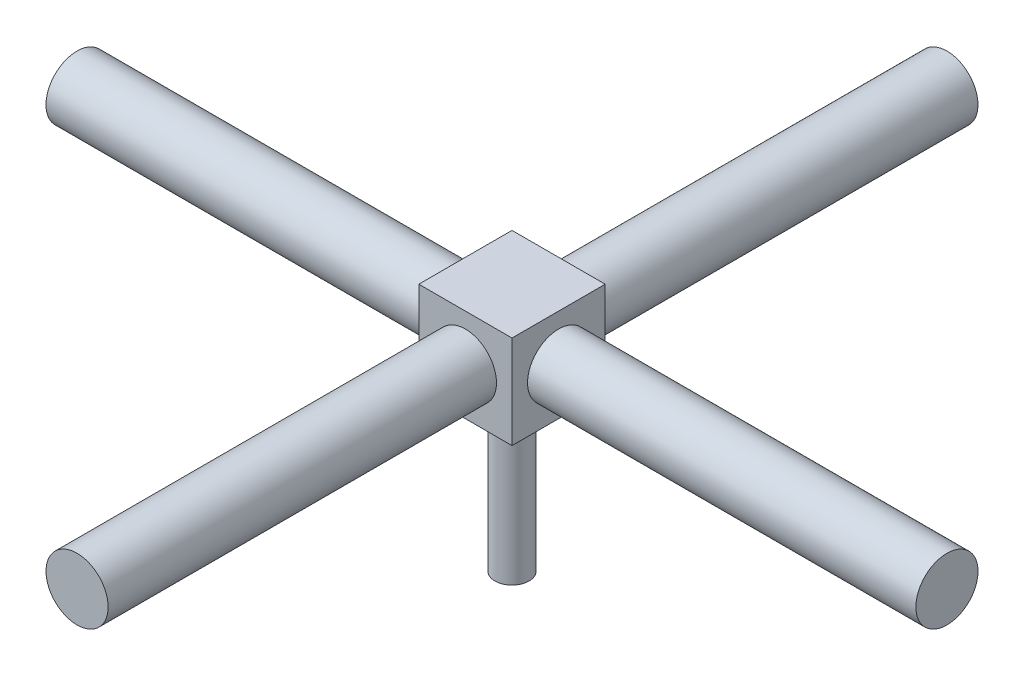
ISO-10303-21;
HEADER;
FILE_DESCRIPTION(('STEP AP214'),'2;1');
FILE_NAME('part.step','',(''),(''),'','','');
FILE_SCHEMA(('AUTOMOTIVE_DESIGN { 1 0 10303 214 1 1 1 1 }'));
ENDSEC;
DATA;
#1=APPLICATION_CONTEXT('core data for automotive mechanical design processes');
#2=APPLICATION_PROTOCOL_DEFINITION('international standard','automotive_design',2000,#1);
#3=PRODUCT_CONTEXT('',#1,'mechanical');
#4=PRODUCT('Part','Part','',(#3));
#5=PRODUCT_RELATED_PRODUCT_CATEGORY('part','',(#4));
#6=PRODUCT_DEFINITION_FORMATION('','',#4);
#7=PRODUCT_DEFINITION_CONTEXT('part definition',#1,'design');
#8=PRODUCT_DEFINITION('design','',#6,#7);
#9=PRODUCT_DEFINITION_SHAPE('','',#8);
#10=(LENGTH_UNIT() NAMED_UNIT(*) SI_UNIT(.MILLI.,.METRE.));
#11=(NAMED_UNIT(*) PLANE_ANGLE_UNIT() SI_UNIT($,.RADIAN.));
#12=(NAMED_UNIT(*) SI_UNIT($,.STERADIAN.) SOLID_ANGLE_UNIT());
#13=UNCERTAINTY_MEASURE_WITH_UNIT(LENGTH_MEASURE(1.E-05),#10,'distance_accuracy_value','');
#14=(GEOMETRIC_REPRESENTATION_CONTEXT(3) GLOBAL_UNCERTAINTY_ASSIGNED_CONTEXT((#13)) GLOBAL_UNIT_ASSIGNED_CONTEXT((#10,
#11,#12)) REPRESENTATION_CONTEXT('',''));
#15=CARTESIAN_POINT('',(0.,0.,0.));
#16=DIRECTION('',(0.,0.,1.));
#17=DIRECTION('',(1.,0.,0.));
#18=AXIS2_PLACEMENT_3D('',#15,#16,#17);
#19=CARTESIAN_POINT('',(-30.,60.,-30.));
#20=DIRECTION('',(1.,0.,0.));
#21=DIRECTION('',(0.,0.,-1.));
#22=AXIS2_PLACEMENT_3D('',#19,#20,#21);
#23=PLANE('',#22);
#24=CARTESIAN_POINT('',(-30.,30.,0.));
#25=DIRECTION('',(-1.,0.,0.));
#26=DIRECTION('',(0.,0.,1.));
#27=AXIS2_PLACEMENT_3D('',#24,#25,#26);
#28=CIRCLE('',#27,20.);
#29=CARTESIAN_POINT('',(-30.,30.,20.));
#30=VERTEX_POINT('',#29);
#31=EDGE_CURVE('E138',#30,#30,#28,.T.);
#32=ORIENTED_EDGE('',*,*,#31,.F.);
#33=EDGE_LOOP('',(#32));
#34=FACE_BOUND('',#33,.T.);
#35=DIRECTION('',(0.,0.,1.));
#36=VECTOR('',#35,1.);
#37=CARTESIAN_POINT('',(-30.,0.,-30.));
#38=LINE('',#37,#36);
#39=CARTESIAN_POINT('',(-30.,0.,-30.));
#40=VERTEX_POINT('',#39);
#41=CARTESIAN_POINT('',(-30.,0.,30.));
#42=VERTEX_POINT('',#41);
#43=EDGE_CURVE('E113',#40,#42,#38,.T.);
#44=ORIENTED_EDGE('',*,*,#43,.T.);
#45=DIRECTION('',(0.,-1.,0.));
#46=VECTOR('',#45,1.);
#47=CARTESIAN_POINT('',(-30.,60.,30.));
#48=LINE('',#47,#46);
#49=CARTESIAN_POINT('',(-30.,60.,30.));
#50=VERTEX_POINT('',#49);
#51=EDGE_CURVE('E44',#50,#42,#48,.T.);
#52=ORIENTED_EDGE('',*,*,#51,.F.);
#53=DIRECTION('',(0.,0.,1.));
#54=VECTOR('',#53,1.);
#55=CARTESIAN_POINT('',(-30.,60.,-30.));
#56=LINE('',#55,#54);
#57=CARTESIAN_POINT('',(-30.,60.,-30.));
#58=VERTEX_POINT('',#57);
#59=EDGE_CURVE('E96',#58,#50,#56,.T.);
#60=ORIENTED_EDGE('',*,*,#59,.F.);
#61=DIRECTION('',(0.,-1.,0.));
#62=VECTOR('',#61,1.);
#63=CARTESIAN_POINT('',(-30.,60.,-30.));
#64=LINE('',#63,#62);
#65=EDGE_CURVE('E109',#58,#40,#64,.T.);
#66=ORIENTED_EDGE('',*,*,#65,.T.);
#67=EDGE_LOOP('',(#44,#52,#60,#66));
#68=FACE_BOUND('',#67,.T.);
#69=ADVANCED_FACE('F41',(#34,#68),#23,.F.);
#70=CARTESIAN_POINT('',(30.,60.,30.));
#71=DIRECTION('',(0.,0.,-1.));
#72=DIRECTION('',(-1.,0.,0.));
#73=AXIS2_PLACEMENT_3D('',#70,#71,#72);
#74=PLANE('',#73);
#75=CARTESIAN_POINT('',(0.,30.,30.));
#76=DIRECTION('',(0.,0.,1.));
#77=DIRECTION('',(1.,0.,0.));
#78=AXIS2_PLACEMENT_3D('',#75,#76,#77);
#79=CIRCLE('',#78,20.);
#80=CARTESIAN_POINT('',(20.,30.,30.));
#81=VERTEX_POINT('',#80);
#82=EDGE_CURVE('E134',#81,#81,#79,.T.);
#83=ORIENTED_EDGE('',*,*,#82,.F.);
#84=EDGE_LOOP('',(#83));
#85=FACE_BOUND('',#84,.T.);
#86=DIRECTION('',(1.,0.,0.));
#87=VECTOR('',#86,1.);
#88=CARTESIAN_POINT('',(30.,0.,30.));
#89=LINE('',#88,#87);
#90=CARTESIAN_POINT('',(30.,0.,30.));
#91=VERTEX_POINT('',#90);
#92=EDGE_CURVE('E102',#42,#91,#89,.T.);
#93=ORIENTED_EDGE('',*,*,#92,.T.);
#94=DIRECTION('',(0.,-1.,0.));
#95=VECTOR('',#94,1.);
#96=CARTESIAN_POINT('',(30.,60.,30.));
#97=LINE('',#96,#95);
#98=CARTESIAN_POINT('',(30.,60.,30.));
#99=VERTEX_POINT('',#98);
#100=EDGE_CURVE('E100',#99,#91,#97,.T.);
#101=ORIENTED_EDGE('',*,*,#100,.F.);
#102=DIRECTION('',(1.,0.,0.));
#103=VECTOR('',#102,1.);
#104=CARTESIAN_POINT('',(30.,60.,30.));
#105=LINE('',#104,#103);
#106=EDGE_CURVE('E91',#50,#99,#105,.T.);
#107=ORIENTED_EDGE('',*,*,#106,.F.);
#108=ORIENTED_EDGE('',*,*,#51,.T.);
#109=EDGE_LOOP('',(#93,#101,#107,#108));
#110=FACE_BOUND('',#109,.T.);
#111=ADVANCED_FACE('F101',(#85,#110),#74,.F.);
#112=CARTESIAN_POINT('',(30.,60.,-30.));
#113=DIRECTION('',(-1.,0.,0.));
#114=DIRECTION('',(0.,0.,1.));
#115=AXIS2_PLACEMENT_3D('',#112,#113,#114);
#116=PLANE('',#115);
#117=CARTESIAN_POINT('',(30.,30.,0.));
#118=DIRECTION('',(1.,0.,0.));
#119=DIRECTION('',(0.,0.,-1.));
#120=AXIS2_PLACEMENT_3D('',#117,#118,#119);
#121=CIRCLE('',#120,20.);
#122=CARTESIAN_POINT('',(30.,30.,-20.));
#123=VERTEX_POINT('',#122);
#124=EDGE_CURVE('E51',#123,#123,#121,.T.);
#125=ORIENTED_EDGE('',*,*,#124,.F.);
#126=EDGE_LOOP('',(#125));
#127=FACE_BOUND('',#126,.T.);
#128=DIRECTION('',(0.,0.,-1.));
#129=VECTOR('',#128,1.);
#130=CARTESIAN_POINT('',(30.,0.,-30.));
#131=LINE('',#130,#129);
#132=CARTESIAN_POINT('',(30.,0.,-30.));
#133=VERTEX_POINT('',#132);
#134=EDGE_CURVE('E77',#91,#133,#131,.T.);
#135=ORIENTED_EDGE('',*,*,#134,.T.);
#136=DIRECTION('',(0.,-1.,0.));
#137=VECTOR('',#136,1.);
#138=CARTESIAN_POINT('',(30.,60.,-30.));
#139=LINE('',#138,#137);
#140=CARTESIAN_POINT('',(30.,60.,-30.));
#141=VERTEX_POINT('',#140);
#142=EDGE_CURVE('E104',#141,#133,#139,.T.);
#143=ORIENTED_EDGE('',*,*,#142,.F.);
#144=DIRECTION('',(0.,0.,-1.));
#145=VECTOR('',#144,1.);
#146=CARTESIAN_POINT('',(30.,60.,-30.));
#147=LINE('',#146,#145);
#148=EDGE_CURVE('E94',#99,#141,#147,.T.);
#149=ORIENTED_EDGE('',*,*,#148,.F.);
#150=ORIENTED_EDGE('',*,*,#100,.T.);
#151=EDGE_LOOP('',(#135,#143,#149,#150));
#152=FACE_BOUND('',#151,.T.);
#153=ADVANCED_FACE('F105',(#127,#152),#116,.F.);
#154=CARTESIAN_POINT('',(30.,60.,-30.));
#155=DIRECTION('',(0.,0.,1.));
#156=DIRECTION('',(1.,0.,0.));
#157=AXIS2_PLACEMENT_3D('',#154,#155,#156);
#158=PLANE('',#157);
#159=CARTESIAN_POINT('',(0.,30.,-30.));
#160=DIRECTION('',(0.,0.,-1.));
#161=DIRECTION('',(-1.,0.,0.));
#162=AXIS2_PLACEMENT_3D('',#159,#160,#161);
#163=CIRCLE('',#162,20.);
#164=CARTESIAN_POINT('',(-20.,30.,-30.));
#165=VERTEX_POINT('',#164);
#166=EDGE_CURVE('E146',#165,#165,#163,.T.);
#167=ORIENTED_EDGE('',*,*,#166,.F.);
#168=EDGE_LOOP('',(#167));
#169=FACE_BOUND('',#168,.T.);
#170=DIRECTION('',(-1.,0.,0.));
#171=VECTOR('',#170,1.);
#172=CARTESIAN_POINT('',(30.,0.,-30.));
#173=LINE('',#172,#171);
#174=EDGE_CURVE('E83',#133,#40,#173,.T.);
#175=ORIENTED_EDGE('',*,*,#174,.T.);
#176=ORIENTED_EDGE('',*,*,#65,.F.);
#177=DIRECTION('',(-1.,0.,0.));
#178=VECTOR('',#177,1.);
#179=CARTESIAN_POINT('',(30.,60.,-30.));
#180=LINE('',#179,#178);
#181=EDGE_CURVE('E60',#141,#58,#180,.T.);
#182=ORIENTED_EDGE('',*,*,#181,.F.);
#183=ORIENTED_EDGE('',*,*,#142,.T.);
#184=EDGE_LOOP('',(#175,#176,#182,#183));
#185=FACE_BOUND('',#184,.T.);
#186=ADVANCED_FACE('F127',(#169,#185),#158,.F.);
#187=CARTESIAN_POINT('',(0.,60.,0.));
#188=DIRECTION('',(0.,-1.,0.));
#189=DIRECTION('',(0.,0.,-1.));
#190=AXIS2_PLACEMENT_3D('',#187,#188,#189);
#191=PLANE('',#190);
#192=ORIENTED_EDGE('',*,*,#59,.T.);
#193=ORIENTED_EDGE('',*,*,#106,.T.);
#194=ORIENTED_EDGE('',*,*,#148,.T.);
#195=ORIENTED_EDGE('',*,*,#181,.T.);
#196=EDGE_LOOP('',(#192,#193,#194,#195));
#197=FACE_BOUND('',#196,.T.);
#198=ADVANCED_FACE('F92',(#197),#191,.F.);
#199=CARTESIAN_POINT('',(0.,0.,0.));
#200=DIRECTION('',(0.,-1.,0.));
#201=DIRECTION('',(0.,0.,-1.));
#202=AXIS2_PLACEMENT_3D('',#199,#200,#201);
#203=PLANE('',#202);
#204=CARTESIAN_POINT('',(0.,0.,0.));
#205=DIRECTION('',(0.,-1.,0.));
#206=DIRECTION('',(0.,0.,-1.));
#207=AXIS2_PLACEMENT_3D('',#204,#205,#206);
#208=CIRCLE('',#207,11.);
#209=CARTESIAN_POINT('',(0.,0.,-11.));
#210=VERTEX_POINT('',#209);
#211=EDGE_CURVE('E11',#210,#210,#208,.T.);
#212=ORIENTED_EDGE('',*,*,#211,.F.);
#213=EDGE_LOOP('',(#212));
#214=FACE_BOUND('',#213,.T.);
#215=ORIENTED_EDGE('',*,*,#43,.F.);
#216=ORIENTED_EDGE('',*,*,#174,.F.);
#217=ORIENTED_EDGE('',*,*,#134,.F.);
#218=ORIENTED_EDGE('',*,*,#92,.F.);
#219=EDGE_LOOP('',(#215,#216,#217,#218));
#220=FACE_BOUND('',#219,.T.);
#221=ADVANCED_FACE('F130',(#214,#220),#203,.T.);
#222=CARTESIAN_POINT('',(0.,30.,280.));
#223=DIRECTION('',(0.,0.,-1.));
#224=DIRECTION('',(-1.,0.,0.));
#225=AXIS2_PLACEMENT_3D('',#222,#223,#224);
#226=CYLINDRICAL_SURFACE('',#225,20.);
#227=CARTESIAN_POINT('',(0.,30.,280.));
#228=DIRECTION('',(0.,0.,1.));
#229=DIRECTION('',(1.,0.,0.));
#230=AXIS2_PLACEMENT_3D('',#227,#228,#229);
#231=CIRCLE('',#230,20.);
#232=CARTESIAN_POINT('',(20.,30.,280.));
#233=VERTEX_POINT('',#232);
#234=EDGE_CURVE('E117',#233,#233,#231,.T.);
#235=ORIENTED_EDGE('',*,*,#234,.F.);
#236=EDGE_LOOP('',(#235));
#237=FACE_BOUND('',#236,.T.);
#238=ORIENTED_EDGE('',*,*,#82,.T.);
#239=EDGE_LOOP('',(#238));
#240=FACE_BOUND('',#239,.T.);
#241=ADVANCED_FACE('F179',(#237,#240),#226,.T.);
#242=CARTESIAN_POINT('',(0.,30.,280.));
#243=DIRECTION('',(0.,0.,1.));
#244=DIRECTION('',(1.,0.,0.));
#245=AXIS2_PLACEMENT_3D('',#242,#243,#244);
#246=PLANE('',#245);
#247=ORIENTED_EDGE('',*,*,#234,.T.);
#248=EDGE_LOOP('',(#247));
#249=FACE_BOUND('',#248,.T.);
#250=ADVANCED_FACE('F185',(#249),#246,.T.);
#251=CARTESIAN_POINT('',(-280.,30.,0.));
#252=DIRECTION('',(1.,0.,0.));
#253=DIRECTION('',(0.,0.,-1.));
#254=AXIS2_PLACEMENT_3D('',#251,#252,#253);
#255=CYLINDRICAL_SURFACE('',#254,20.);
#256=CARTESIAN_POINT('',(-280.,30.,0.));
#257=DIRECTION('',(-1.,0.,0.));
#258=DIRECTION('',(0.,0.,1.));
#259=AXIS2_PLACEMENT_3D('',#256,#257,#258);
#260=CIRCLE('',#259,20.);
#261=CARTESIAN_POINT('',(-280.,30.,20.));
#262=VERTEX_POINT('',#261);
#263=EDGE_CURVE('E142',#262,#262,#260,.T.);
#264=ORIENTED_EDGE('',*,*,#263,.F.);
#265=EDGE_LOOP('',(#264));
#266=FACE_BOUND('',#265,.T.);
#267=ORIENTED_EDGE('',*,*,#31,.T.);
#268=EDGE_LOOP('',(#267));
#269=FACE_BOUND('',#268,.T.);
#270=ADVANCED_FACE('F198',(#266,#269),#255,.T.);
#271=CARTESIAN_POINT('',(-280.,30.,0.));
#272=DIRECTION('',(-1.,0.,0.));
#273=DIRECTION('',(0.,0.,1.));
#274=AXIS2_PLACEMENT_3D('',#271,#272,#273);
#275=PLANE('',#274);
#276=ORIENTED_EDGE('',*,*,#263,.T.);
#277=EDGE_LOOP('',(#276));
#278=FACE_BOUND('',#277,.T.);
#279=ADVANCED_FACE('F200',(#278),#275,.T.);
#280=CARTESIAN_POINT('',(0.,30.,-280.));
#281=DIRECTION('',(0.,0.,1.));
#282=DIRECTION('',(1.,0.,0.));
#283=AXIS2_PLACEMENT_3D('',#280,#281,#282);
#284=CYLINDRICAL_SURFACE('',#283,20.);
#285=CARTESIAN_POINT('',(0.,30.,-280.));
#286=DIRECTION('',(0.,0.,-1.));
#287=DIRECTION('',(-1.,0.,0.));
#288=AXIS2_PLACEMENT_3D('',#285,#286,#287);
#289=CIRCLE('',#288,20.);
#290=CARTESIAN_POINT('',(-20.,30.,-280.));
#291=VERTEX_POINT('',#290);
#292=EDGE_CURVE('E150',#291,#291,#289,.T.);
#293=ORIENTED_EDGE('',*,*,#292,.F.);
#294=EDGE_LOOP('',(#293));
#295=FACE_BOUND('',#294,.T.);
#296=ORIENTED_EDGE('',*,*,#166,.T.);
#297=EDGE_LOOP('',(#296));
#298=FACE_BOUND('',#297,.T.);
#299=ADVANCED_FACE('F207',(#295,#298),#284,.T.);
#300=CARTESIAN_POINT('',(0.,30.,-280.));
#301=DIRECTION('',(0.,0.,-1.));
#302=DIRECTION('',(-1.,0.,0.));
#303=AXIS2_PLACEMENT_3D('',#300,#301,#302);
#304=PLANE('',#303);
#305=ORIENTED_EDGE('',*,*,#292,.T.);
#306=EDGE_LOOP('',(#305));
#307=FACE_BOUND('',#306,.T.);
#308=ADVANCED_FACE('F216',(#307),#304,.T.);
#309=CARTESIAN_POINT('',(280.,30.,0.));
#310=DIRECTION('',(-1.,0.,0.));
#311=DIRECTION('',(0.,0.,1.));
#312=AXIS2_PLACEMENT_3D('',#309,#310,#311);
#313=CYLINDRICAL_SURFACE('',#312,20.);
#314=CARTESIAN_POINT('',(280.,30.,0.));
#315=DIRECTION('',(1.,0.,0.));
#316=DIRECTION('',(0.,0.,-1.));
#317=AXIS2_PLACEMENT_3D('',#314,#315,#316);
#318=CIRCLE('',#317,20.);
#319=CARTESIAN_POINT('',(280.,30.,-20.));
#320=VERTEX_POINT('',#319);
#321=EDGE_CURVE('E157',#320,#320,#318,.T.);
#322=ORIENTED_EDGE('',*,*,#321,.F.);
#323=EDGE_LOOP('',(#322));
#324=FACE_BOUND('',#323,.T.);
#325=ORIENTED_EDGE('',*,*,#124,.T.);
#326=EDGE_LOOP('',(#325));
#327=FACE_BOUND('',#326,.T.);
#328=ADVANCED_FACE('F220',(#324,#327),#313,.T.);
#329=CARTESIAN_POINT('',(280.,30.,0.));
#330=DIRECTION('',(1.,0.,0.));
#331=DIRECTION('',(0.,0.,-1.));
#332=AXIS2_PLACEMENT_3D('',#329,#330,#331);
#333=PLANE('',#332);
#334=ORIENTED_EDGE('',*,*,#321,.T.);
#335=EDGE_LOOP('',(#334));
#336=FACE_BOUND('',#335,.T.);
#337=ADVANCED_FACE('F174',(#336),#333,.T.);
#338=CARTESIAN_POINT('',(0.,-100.,0.));
#339=DIRECTION('',(0.,1.,0.));
#340=DIRECTION('',(0.,0.,1.));
#341=AXIS2_PLACEMENT_3D('',#338,#339,#340);
#342=CYLINDRICAL_SURFACE('',#341,11.);
#343=CARTESIAN_POINT('',(0.,-100.,0.));
#344=DIRECTION('',(0.,-1.,0.));
#345=DIRECTION('',(0.,0.,-1.));
#346=AXIS2_PLACEMENT_3D('',#343,#344,#345);
#347=CIRCLE('',#346,11.);
#348=CARTESIAN_POINT('',(0.,-100.,-11.));
#349=VERTEX_POINT('',#348);
#350=EDGE_CURVE('E163',#349,#349,#347,.T.);
#351=ORIENTED_EDGE('',*,*,#350,.F.);
#352=EDGE_LOOP('',(#351));
#353=FACE_BOUND('',#352,.T.);
#354=ORIENTED_EDGE('',*,*,#211,.T.);
#355=EDGE_LOOP('',(#354));
#356=FACE_BOUND('',#355,.T.);
#357=ADVANCED_FACE('F171',(#353,#356),#342,.T.);
#358=CARTESIAN_POINT('',(0.,-100.,0.));
#359=DIRECTION('',(0.,-1.,0.));
#360=DIRECTION('',(0.,0.,-1.));
#361=AXIS2_PLACEMENT_3D('',#358,#359,#360);
#362=PLANE('',#361);
#363=ORIENTED_EDGE('',*,*,#350,.T.);
#364=EDGE_LOOP('',(#363));
#365=FACE_BOUND('',#364,.T.);
#366=ADVANCED_FACE('F169',(#365),#362,.T.);
#367=CLOSED_SHELL('',(#69,#111,#153,#186,#198,#221,#241,#250,#270,#279,#299,#308,#328,#337,#357,#366));
#368=MANIFOLD_SOLID_BREP('B2',#367);
#369=ADVANCED_BREP_SHAPE_REPRESENTATION('',(#18,#368),#14);
#370=SHAPE_DEFINITION_REPRESENTATION(#9,#369);
ENDSEC;
END-ISO-10303-21;
